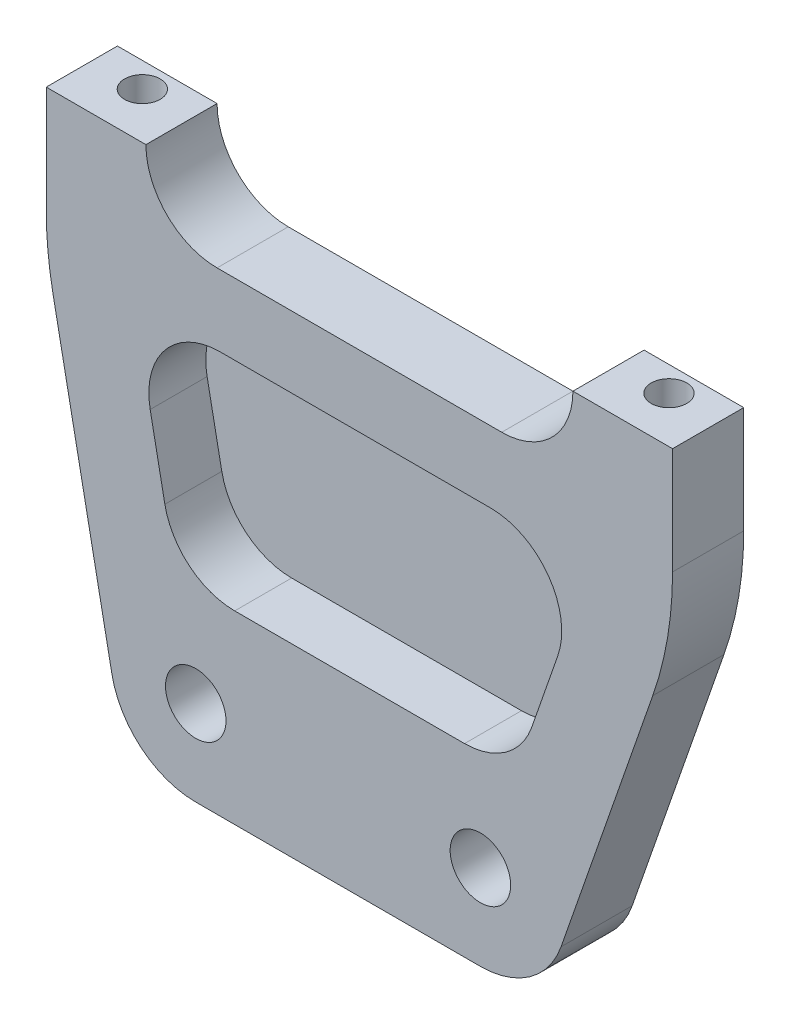
ISO-10303-21;
HEADER;
FILE_DESCRIPTION(('STEP AP214'),'2;1');
FILE_NAME('part.step','',(''),(''),'','','');
FILE_SCHEMA(('AUTOMOTIVE_DESIGN { 1 0 10303 214 1 1 1 1 }'));
ENDSEC;
DATA;
#1=APPLICATION_CONTEXT('core data for automotive mechanical design processes');
#2=APPLICATION_PROTOCOL_DEFINITION('international standard','automotive_design',2000,#1);
#3=PRODUCT_CONTEXT('',#1,'mechanical');
#4=PRODUCT('Part','Part','',(#3));
#5=PRODUCT_RELATED_PRODUCT_CATEGORY('part','',(#4));
#6=PRODUCT_DEFINITION_FORMATION('','',#4);
#7=PRODUCT_DEFINITION_CONTEXT('part definition',#1,'design');
#8=PRODUCT_DEFINITION('design','',#6,#7);
#9=PRODUCT_DEFINITION_SHAPE('','',#8);
#10=(LENGTH_UNIT() NAMED_UNIT(*) SI_UNIT(.MILLI.,.METRE.));
#11=(NAMED_UNIT(*) PLANE_ANGLE_UNIT() SI_UNIT($,.RADIAN.));
#12=(NAMED_UNIT(*) SI_UNIT($,.STERADIAN.) SOLID_ANGLE_UNIT());
#13=UNCERTAINTY_MEASURE_WITH_UNIT(LENGTH_MEASURE(1.E-05),#10,'distance_accuracy_value','');
#14=(GEOMETRIC_REPRESENTATION_CONTEXT(3) GLOBAL_UNCERTAINTY_ASSIGNED_CONTEXT((#13)) GLOBAL_UNIT_ASSIGNED_CONTEXT((#10,
#11,#12)) REPRESENTATION_CONTEXT('',''));
#15=CARTESIAN_POINT('',(0.,0.,0.));
#16=DIRECTION('',(0.,0.,1.));
#17=DIRECTION('',(1.,0.,0.));
#18=AXIS2_PLACEMENT_3D('',#15,#16,#17);
#19=CARTESIAN_POINT('',(-21.,49.5,12.7));
#20=DIRECTION('',(1.,0.,0.));
#21=DIRECTION('',(0.,0.,-1.));
#22=AXIS2_PLACEMENT_3D('',#19,#20,#21);
#23=PLANE('',#22);
#24=DIRECTION('',(0.,-1.,0.));
#25=VECTOR('',#24,1.);
#26=CARTESIAN_POINT('',(-21.,64.5,10.));
#27=LINE('',#26,#25);
#28=CARTESIAN_POINT('',(-21.,64.5,10.));
#29=VERTEX_POINT('',#28);
#30=CARTESIAN_POINT('',(-21.,49.5,10.));
#31=VERTEX_POINT('',#30);
#32=EDGE_CURVE('E212',#29,#31,#27,.T.);
#33=ORIENTED_EDGE('',*,*,#32,.F.);
#34=DIRECTION('',(0.,0.,-1.));
#35=VECTOR('',#34,1.);
#36=CARTESIAN_POINT('',(-21.,64.5,12.7));
#37=LINE('',#36,#35);
#38=CARTESIAN_POINT('',(-21.,64.5,0.));
#39=VERTEX_POINT('',#38);
#40=EDGE_CURVE('E289',#29,#39,#37,.T.);
#41=ORIENTED_EDGE('',*,*,#40,.T.);
#42=DIRECTION('',(0.,-1.,0.));
#43=VECTOR('',#42,1.);
#44=CARTESIAN_POINT('',(-21.,49.5,0.));
#45=LINE('',#44,#43);
#46=CARTESIAN_POINT('',(-21.,49.5,0.));
#47=VERTEX_POINT('',#46);
#48=EDGE_CURVE('E305',#39,#47,#45,.T.);
#49=ORIENTED_EDGE('',*,*,#48,.T.);
#50=DIRECTION('',(0.,0.,-1.));
#51=VECTOR('',#50,1.);
#52=CARTESIAN_POINT('',(-21.,49.5,12.7));
#53=LINE('',#52,#51);
#54=EDGE_CURVE('E54',#31,#47,#53,.T.);
#55=ORIENTED_EDGE('',*,*,#54,.F.);
#56=EDGE_LOOP('',(#33,#41,#49,#55));
#57=FACE_BOUND('',#56,.T.);
#58=ADVANCED_FACE('F46',(#57),#23,.F.);
#59=CARTESIAN_POINT('',(29.,49.5,12.7));
#60=DIRECTION('',(0.,0.,-1.));
#61=DIRECTION('',(-1.,0.,0.));
#62=AXIS2_PLACEMENT_3D('',#59,#60,#61);
#63=CYLINDRICAL_SURFACE('',#62,50.);
#64=CARTESIAN_POINT('',(29.,49.5,10.));
#65=DIRECTION('',(0.,0.,1.));
#66=DIRECTION('',(0.,-1.,0.));
#67=AXIS2_PLACEMENT_3D('',#64,#65,#66);
#68=CIRCLE('',#67,50.);
#69=CARTESIAN_POINT('',(-20.0617925425191,39.8594340148091,10.));
#70=VERTEX_POINT('',#69);
#71=EDGE_CURVE('E468',#31,#70,#68,.T.);
#72=ORIENTED_EDGE('',*,*,#71,.F.);
#73=ORIENTED_EDGE('',*,*,#54,.T.);
#74=CARTESIAN_POINT('',(29.,49.5,0.));
#75=DIRECTION('',(0.,0.,1.));
#76=DIRECTION('',(-1.,0.,0.));
#77=AXIS2_PLACEMENT_3D('',#74,#75,#76);
#78=CIRCLE('',#77,50.);
#79=CARTESIAN_POINT('',(-20.0617925425191,39.8594340148091,0.));
#80=VERTEX_POINT('',#79);
#81=EDGE_CURVE('E309',#47,#80,#78,.T.);
#82=ORIENTED_EDGE('',*,*,#81,.T.);
#83=DIRECTION('',(0.,0.,-1.));
#84=VECTOR('',#83,1.);
#85=CARTESIAN_POINT('',(-20.0617925425191,39.8594340148091,12.7));
#86=LINE('',#85,#84);
#87=EDGE_CURVE('E327',#70,#80,#86,.T.);
#88=ORIENTED_EDGE('',*,*,#87,.F.);
#89=EDGE_LOOP('',(#72,#73,#82,#88));
#90=FACE_BOUND('',#89,.T.);
#91=ADVANCED_FACE('F518',(#90),#63,.T.);
#92=CARTESIAN_POINT('',(-11.7748302102046,-2.3137358364458,12.7));
#93=DIRECTION('',(0.981235850850382,0.192811319703817,0.));
#94=DIRECTION('',(-0.192811319703817,0.981235850850382,0.));
#95=AXIS2_PLACEMENT_3D('',#92,#93,#94);
#96=PLANE('',#95);
#97=DIRECTION('',(-0.192811319703817,0.981235850850382,0.));
#98=VECTOR('',#97,1.);
#99=CARTESIAN_POINT('',(-11.7748302102046,-2.3137358364458,10.));
#100=LINE('',#99,#98);
#101=CARTESIAN_POINT('',(-11.7748302102046,-2.31373583644581,10.));
#102=VERTEX_POINT('',#101);
#103=EDGE_CURVE('E844',#102,#70,#100,.T.);
#104=ORIENTED_EDGE('',*,*,#103,.T.);
#105=ORIENTED_EDGE('',*,*,#87,.T.);
#106=DIRECTION('',(0.192811319703817,-0.981235850850382,0.));
#107=VECTOR('',#106,1.);
#108=CARTESIAN_POINT('',(-11.7748302102046,-2.3137358364458,0.));
#109=LINE('',#108,#107);
#110=CARTESIAN_POINT('',(-11.7748302102046,-2.31373583644581,0.));
#111=VERTEX_POINT('',#110);
#112=EDGE_CURVE('E313',#80,#111,#109,.T.);
#113=ORIENTED_EDGE('',*,*,#112,.T.);
#114=DIRECTION('',(0.,0.,-1.));
#115=VECTOR('',#114,1.);
#116=CARTESIAN_POINT('',(-11.7748302102046,-2.31373583644581,12.7));
#117=LINE('',#116,#115);
#118=EDGE_CURVE('E330',#102,#111,#117,.T.);
#119=ORIENTED_EDGE('',*,*,#118,.F.);
#120=EDGE_LOOP('',(#104,#105,#113,#119));
#121=FACE_BOUND('',#120,.T.);
#122=ADVANCED_FACE('F523',(#121),#96,.F.);
#123=CARTESIAN_POINT('',(64.2186319820096,33.0561320320449,12.7));
#124=DIRECTION('',(-0.944372639640192,0.328877359359102,0.));
#125=DIRECTION('',(-0.328877359359102,-0.944372639640192,0.));
#126=AXIS2_PLACEMENT_3D('',#123,#124,#125);
#127=PLANE('',#126);
#128=DIRECTION('',(0.,0.,-1.));
#129=VECTOR('',#128,1.);
#130=CARTESIAN_POINT('',(64.2186319820096,33.0561320320449,12.7));
#131=LINE('',#130,#129);
#132=CARTESIAN_POINT('',(64.2186319820096,33.0561320320449,10.));
#133=VERTEX_POINT('',#132);
#134=CARTESIAN_POINT('',(64.2186319820096,33.0561320320449,0.));
#135=VERTEX_POINT('',#134);
#136=EDGE_CURVE('E229',#133,#135,#131,.T.);
#137=ORIENTED_EDGE('',*,*,#136,.F.);
#138=DIRECTION('',(-0.328877359359102,-0.944372639640192,0.));
#139=VECTOR('',#138,1.);
#140=CARTESIAN_POINT('',(64.2186319820096,33.0561320320449,10.));
#141=LINE('',#140,#139);
#142=CARTESIAN_POINT('',(51.3324716756823,-3.94652831230924,9.99999999999999));
#143=VERTEX_POINT('',#142);
#144=EDGE_CURVE('E504',#133,#143,#141,.T.);
#145=ORIENTED_EDGE('',*,*,#144,.T.);
#146=DIRECTION('',(0.,0.,-1.));
#147=VECTOR('',#146,1.);
#148=CARTESIAN_POINT('',(51.3324716756823,-3.94652831230923,12.7));
#149=LINE('',#148,#147);
#150=CARTESIAN_POINT('',(51.3324716756823,-3.94652831230923,0.));
#151=VERTEX_POINT('',#150);
#152=EDGE_CURVE('E856',#143,#151,#149,.T.);
#153=ORIENTED_EDGE('',*,*,#152,.T.);
#154=DIRECTION('',(0.328877359359102,0.944372639640192,0.));
#155=VECTOR('',#154,1.);
#156=CARTESIAN_POINT('',(64.2186319820096,33.0561320320449,0.));
#157=LINE('',#156,#155);
#158=EDGE_CURVE('E250',#151,#135,#157,.T.);
#159=ORIENTED_EDGE('',*,*,#158,.T.);
#160=EDGE_LOOP('',(#137,#145,#153,#159));
#161=FACE_BOUND('',#160,.T.);
#162=ADVANCED_FACE('F527',(#161),#127,.F.);
#163=CARTESIAN_POINT('',(17.,49.5,12.7));
#164=DIRECTION('',(0.,0.,-1.));
#165=DIRECTION('',(-1.,0.,0.));
#166=AXIS2_PLACEMENT_3D('',#163,#164,#165);
#167=CYLINDRICAL_SURFACE('',#166,50.);
#168=CARTESIAN_POINT('',(17.,49.5,10.));
#169=DIRECTION('',(0.,0.,1.));
#170=DIRECTION('',(0.,-1.,0.));
#171=AXIS2_PLACEMENT_3D('',#168,#169,#170);
#172=CIRCLE('',#171,50.);
#173=CARTESIAN_POINT('',(67.,49.5,10.));
#174=VERTEX_POINT('',#173);
#175=EDGE_CURVE('E208',#133,#174,#172,.T.);
#176=ORIENTED_EDGE('',*,*,#175,.F.);
#177=ORIENTED_EDGE('',*,*,#136,.T.);
#178=CARTESIAN_POINT('',(17.,49.5,0.));
#179=DIRECTION('',(0.,0.,1.));
#180=DIRECTION('',(-1.,0.,0.));
#181=AXIS2_PLACEMENT_3D('',#178,#179,#180);
#182=CIRCLE('',#181,50.);
#183=CARTESIAN_POINT('',(67.,49.5,0.));
#184=VERTEX_POINT('',#183);
#185=EDGE_CURVE('E246',#135,#184,#182,.T.);
#186=ORIENTED_EDGE('',*,*,#185,.T.);
#187=DIRECTION('',(0.,0.,-1.));
#188=VECTOR('',#187,1.);
#189=CARTESIAN_POINT('',(67.,49.5,12.7));
#190=LINE('',#189,#188);
#191=EDGE_CURVE('E227',#174,#184,#190,.T.);
#192=ORIENTED_EDGE('',*,*,#191,.F.);
#193=EDGE_LOOP('',(#176,#177,#186,#192));
#194=FACE_BOUND('',#193,.T.);
#195=ADVANCED_FACE('F546',(#194),#167,.T.);
#196=CARTESIAN_POINT('',(67.,64.5,12.7));
#197=DIRECTION('',(-1.,0.,0.));
#198=DIRECTION('',(0.,0.,1.));
#199=AXIS2_PLACEMENT_3D('',#196,#197,#198);
#200=PLANE('',#199);
#201=DIRECTION('',(0.,-1.,0.));
#202=VECTOR('',#201,1.);
#203=CARTESIAN_POINT('',(67.,64.5,10.));
#204=LINE('',#203,#202);
#205=CARTESIAN_POINT('',(67.,64.5,10.));
#206=VERTEX_POINT('',#205);
#207=EDGE_CURVE('E201',#206,#174,#204,.T.);
#208=ORIENTED_EDGE('',*,*,#207,.T.);
#209=ORIENTED_EDGE('',*,*,#191,.T.);
#210=DIRECTION('',(0.,1.,0.));
#211=VECTOR('',#210,1.);
#212=CARTESIAN_POINT('',(67.,64.5,0.));
#213=LINE('',#212,#211);
#214=CARTESIAN_POINT('',(67.,64.5,0.));
#215=VERTEX_POINT('',#214);
#216=EDGE_CURVE('E225',#184,#215,#213,.T.);
#217=ORIENTED_EDGE('',*,*,#216,.T.);
#218=DIRECTION('',(0.,0.,-1.));
#219=VECTOR('',#218,1.);
#220=CARTESIAN_POINT('',(67.,64.5,12.7));
#221=LINE('',#220,#219);
#222=EDGE_CURVE('E218',#206,#215,#221,.T.);
#223=ORIENTED_EDGE('',*,*,#222,.F.);
#224=EDGE_LOOP('',(#208,#209,#217,#223));
#225=FACE_BOUND('',#224,.T.);
#226=ADVANCED_FACE('F223',(#225),#200,.F.);
#227=CARTESIAN_POINT('',(53.,64.5,12.7));
#228=DIRECTION('',(0.,-1.,0.));
#229=DIRECTION('',(0.,0.,-1.));
#230=AXIS2_PLACEMENT_3D('',#227,#228,#229);
#231=PLANE('',#230);
#232=CARTESIAN_POINT('',(60.,64.5,3.5));
#233=DIRECTION('',(0.,1.,0.));
#234=DIRECTION('',(0.,0.,1.));
#235=AXIS2_PLACEMENT_3D('',#232,#233,#234);
#236=CIRCLE('',#235,2.49999999999999);
#237=CARTESIAN_POINT('',(60.,64.5,5.99999999999999));
#238=VERTEX_POINT('',#237);
#239=EDGE_CURVE('E496',#238,#238,#236,.T.);
#240=ORIENTED_EDGE('',*,*,#239,.F.);
#241=EDGE_LOOP('',(#240));
#242=FACE_BOUND('',#241,.T.);
#243=DIRECTION('',(1.,0.,0.));
#244=VECTOR('',#243,1.);
#245=CARTESIAN_POINT('',(-21.,64.5,10.));
#246=LINE('',#245,#244);
#247=CARTESIAN_POINT('',(53.,64.5,10.));
#248=VERTEX_POINT('',#247);
#249=EDGE_CURVE('E205',#248,#206,#246,.T.);
#250=ORIENTED_EDGE('',*,*,#249,.T.);
#251=ORIENTED_EDGE('',*,*,#222,.T.);
#252=DIRECTION('',(-1.,0.,0.));
#253=VECTOR('',#252,1.);
#254=CARTESIAN_POINT('',(53.,64.5,0.));
#255=LINE('',#254,#253);
#256=CARTESIAN_POINT('',(53.,64.5,0.));
#257=VERTEX_POINT('',#256);
#258=EDGE_CURVE('E255',#215,#257,#255,.T.);
#259=ORIENTED_EDGE('',*,*,#258,.T.);
#260=DIRECTION('',(0.,0.,-1.));
#261=VECTOR('',#260,1.);
#262=CARTESIAN_POINT('',(53.,64.5,12.7));
#263=LINE('',#262,#261);
#264=EDGE_CURVE('E220',#248,#257,#263,.T.);
#265=ORIENTED_EDGE('',*,*,#264,.F.);
#266=EDGE_LOOP('',(#250,#251,#259,#265));
#267=FACE_BOUND('',#266,.T.);
#268=ADVANCED_FACE('F216',(#242,#267),#231,.F.);
#269=CARTESIAN_POINT('',(43.,64.5,12.7));
#270=DIRECTION('',(0.,0.,-1.));
#271=DIRECTION('',(-1.,0.,0.));
#272=AXIS2_PLACEMENT_3D('',#269,#270,#271);
#273=CYLINDRICAL_SURFACE('',#272,10.);
#274=CARTESIAN_POINT('',(43.,64.5,10.));
#275=DIRECTION('',(0.,0.,1.));
#276=DIRECTION('',(0.,-1.,0.));
#277=AXIS2_PLACEMENT_3D('',#274,#275,#276);
#278=CIRCLE('',#277,10.);
#279=CARTESIAN_POINT('',(43.,54.5,10.));
#280=VERTEX_POINT('',#279);
#281=EDGE_CURVE('E471',#248,#280,#278,.F.);
#282=ORIENTED_EDGE('',*,*,#281,.F.);
#283=ORIENTED_EDGE('',*,*,#264,.T.);
#284=CARTESIAN_POINT('',(43.,64.5,0.));
#285=DIRECTION('',(0.,0.,-1.));
#286=DIRECTION('',(1.,0.,0.));
#287=AXIS2_PLACEMENT_3D('',#284,#285,#286);
#288=CIRCLE('',#287,10.);
#289=CARTESIAN_POINT('',(43.,54.5,0.));
#290=VERTEX_POINT('',#289);
#291=EDGE_CURVE('E258',#257,#290,#288,.T.);
#292=ORIENTED_EDGE('',*,*,#291,.T.);
#293=DIRECTION('',(0.,0.,-1.));
#294=VECTOR('',#293,1.);
#295=CARTESIAN_POINT('',(43.,54.5,12.7));
#296=LINE('',#295,#294);
#297=EDGE_CURVE('E231',#280,#290,#296,.T.);
#298=ORIENTED_EDGE('',*,*,#297,.F.);
#299=EDGE_LOOP('',(#282,#283,#292,#298));
#300=FACE_BOUND('',#299,.T.);
#301=ADVANCED_FACE('F555',(#300),#273,.F.);
#302=CARTESIAN_POINT('',(3.,54.5,12.7));
#303=DIRECTION('',(0.,-1.,0.));
#304=DIRECTION('',(0.,0.,-1.));
#305=AXIS2_PLACEMENT_3D('',#302,#303,#304);
#306=PLANE('',#305);
#307=DIRECTION('',(-1.,0.,0.));
#308=VECTOR('',#307,1.);
#309=CARTESIAN_POINT('',(3.,54.5,10.));
#310=LINE('',#309,#308);
#311=CARTESIAN_POINT('',(3.,54.5,10.));
#312=VERTEX_POINT('',#311);
#313=EDGE_CURVE('E473',#280,#312,#310,.T.);
#314=ORIENTED_EDGE('',*,*,#313,.F.);
#315=ORIENTED_EDGE('',*,*,#297,.T.);
#316=DIRECTION('',(-1.,0.,0.));
#317=VECTOR('',#316,1.);
#318=CARTESIAN_POINT('',(3.,54.5,0.));
#319=LINE('',#318,#317);
#320=CARTESIAN_POINT('',(2.99999999999999,54.5,0.));
#321=VERTEX_POINT('',#320);
#322=EDGE_CURVE('E276',#290,#321,#319,.T.);
#323=ORIENTED_EDGE('',*,*,#322,.T.);
#324=DIRECTION('',(0.,0.,-1.));
#325=VECTOR('',#324,1.);
#326=CARTESIAN_POINT('',(2.99999999999999,54.5,12.7));
#327=LINE('',#326,#325);
#328=EDGE_CURVE('E267',#312,#321,#327,.T.);
#329=ORIENTED_EDGE('',*,*,#328,.F.);
#330=EDGE_LOOP('',(#314,#315,#323,#329));
#331=FACE_BOUND('',#330,.T.);
#332=ADVANCED_FACE('F559',(#331),#306,.F.);
#333=CARTESIAN_POINT('',(3.,64.5,12.7));
#334=DIRECTION('',(0.,0.,-1.));
#335=DIRECTION('',(-1.,0.,0.));
#336=AXIS2_PLACEMENT_3D('',#333,#334,#335);
#337=CYLINDRICAL_SURFACE('',#336,10.);
#338=CARTESIAN_POINT('',(3.,64.5,10.));
#339=DIRECTION('',(0.,0.,1.));
#340=DIRECTION('',(0.,-1.,0.));
#341=AXIS2_PLACEMENT_3D('',#338,#339,#340);
#342=CIRCLE('',#341,10.);
#343=CARTESIAN_POINT('',(-7.00000000000001,64.5,10.));
#344=VERTEX_POINT('',#343);
#345=EDGE_CURVE('E475',#312,#344,#342,.F.);
#346=ORIENTED_EDGE('',*,*,#345,.F.);
#347=ORIENTED_EDGE('',*,*,#328,.T.);
#348=CARTESIAN_POINT('',(3.,64.5,0.));
#349=DIRECTION('',(0.,0.,-1.));
#350=DIRECTION('',(1.,0.,0.));
#351=AXIS2_PLACEMENT_3D('',#348,#349,#350);
#352=CIRCLE('',#351,10.);
#353=CARTESIAN_POINT('',(-7.00000000000001,64.5,0.));
#354=VERTEX_POINT('',#353);
#355=EDGE_CURVE('E280',#321,#354,#352,.T.);
#356=ORIENTED_EDGE('',*,*,#355,.T.);
#357=DIRECTION('',(0.,0.,-1.));
#358=VECTOR('',#357,1.);
#359=CARTESIAN_POINT('',(-7.00000000000001,64.5,12.7));
#360=LINE('',#359,#358);
#361=EDGE_CURVE('E270',#344,#354,#360,.T.);
#362=ORIENTED_EDGE('',*,*,#361,.F.);
#363=EDGE_LOOP('',(#346,#347,#356,#362));
#364=FACE_BOUND('',#363,.T.);
#365=ADVANCED_FACE('F563',(#364),#337,.F.);
#366=CARTESIAN_POINT('',(-21.,64.5,12.7));
#367=DIRECTION('',(0.,-1.,0.));
#368=DIRECTION('',(0.,0.,-1.));
#369=AXIS2_PLACEMENT_3D('',#366,#367,#368);
#370=PLANE('',#369);
#371=CARTESIAN_POINT('',(-14.,64.5,3.5));
#372=DIRECTION('',(0.,1.,0.));
#373=DIRECTION('',(0.,0.,1.));
#374=AXIS2_PLACEMENT_3D('',#371,#372,#373);
#375=CIRCLE('',#374,2.49999999999999);
#376=CARTESIAN_POINT('',(-14.,64.5,5.99999999999999));
#377=VERTEX_POINT('',#376);
#378=EDGE_CURVE('E441',#377,#377,#375,.T.);
#379=ORIENTED_EDGE('',*,*,#378,.F.);
#380=EDGE_LOOP('',(#379));
#381=FACE_BOUND('',#380,.T.);
#382=EDGE_CURVE('E221',#29,#344,#246,.T.);
#383=ORIENTED_EDGE('',*,*,#382,.T.);
#384=ORIENTED_EDGE('',*,*,#361,.T.);
#385=DIRECTION('',(-1.,0.,0.));
#386=VECTOR('',#385,1.);
#387=CARTESIAN_POINT('',(-21.,64.5,0.));
#388=LINE('',#387,#386);
#389=EDGE_CURVE('E284',#354,#39,#388,.T.);
#390=ORIENTED_EDGE('',*,*,#389,.T.);
#391=ORIENTED_EDGE('',*,*,#40,.F.);
#392=EDGE_LOOP('',(#383,#384,#390,#391));
#393=FACE_BOUND('',#392,.T.);
#394=ADVANCED_FACE('F300',(#381,#393),#370,.F.);
#395=CARTESIAN_POINT('',(5.47526705475786,24.,12.7));
#396=DIRECTION('',(0.,0.,-1.));
#397=DIRECTION('',(-1.,0.,0.));
#398=AXIS2_PLACEMENT_3D('',#395,#396,#397);
#399=CYLINDRICAL_SURFACE('',#398,10.);
#400=DIRECTION('',(0.,0.,-1.));
#401=VECTOR('',#400,1.);
#402=CARTESIAN_POINT('',(-4.33709145374596,22.0718868029618,12.7));
#403=LINE('',#402,#401);
#404=CARTESIAN_POINT('',(-4.33709145374596,22.0718868029618,10.));
#405=VERTEX_POINT('',#404);
#406=CARTESIAN_POINT('',(-4.33709145374596,22.0718868029618,2.));
#407=VERTEX_POINT('',#406);
#408=EDGE_CURVE('E398',#405,#407,#403,.T.);
#409=ORIENTED_EDGE('',*,*,#408,.F.);
#410=CARTESIAN_POINT('',(5.47526705475786,24.,10.));
#411=DIRECTION('',(0.,0.,-1.));
#412=DIRECTION('',(0.,1.,0.));
#413=AXIS2_PLACEMENT_3D('',#410,#411,#412);
#414=CIRCLE('',#413,10.);
#415=CARTESIAN_POINT('',(5.47526705475786,14.,10.));
#416=VERTEX_POINT('',#415);
#417=EDGE_CURVE('E501',#416,#405,#414,.T.);
#418=ORIENTED_EDGE('',*,*,#417,.F.);
#419=DIRECTION('',(0.,0.,-1.));
#420=VECTOR('',#419,1.);
#421=CARTESIAN_POINT('',(5.47526705475786,14.,12.7));
#422=LINE('',#421,#420);
#423=CARTESIAN_POINT('',(5.47526705475786,14.,2.));
#424=VERTEX_POINT('',#423);
#425=EDGE_CURVE('E311',#416,#424,#422,.T.);
#426=ORIENTED_EDGE('',*,*,#425,.T.);
#427=CARTESIAN_POINT('',(5.47526705475786,24.,2.));
#428=DIRECTION('',(0.,0.,1.));
#429=DIRECTION('',(1.,0.,0.));
#430=AXIS2_PLACEMENT_3D('',#427,#428,#429);
#431=CIRCLE('',#430,10.);
#432=EDGE_CURVE('E405',#407,#424,#431,.T.);
#433=ORIENTED_EDGE('',*,*,#432,.F.);
#434=EDGE_LOOP('',(#409,#418,#426,#433));
#435=FACE_BOUND('',#434,.T.);
#436=ADVANCED_FACE('F570',(#435),#399,.F.);
#437=CARTESIAN_POINT('',(37.7689491552992,24.,12.7));
#438=DIRECTION('',(0.,0.,-1.));
#439=DIRECTION('',(-1.,0.,0.));
#440=AXIS2_PLACEMENT_3D('',#437,#438,#439);
#441=CYLINDRICAL_SURFACE('',#440,10.);
#442=CARTESIAN_POINT('',(37.7689491552992,24.,10.));
#443=DIRECTION('',(0.,0.,-1.));
#444=DIRECTION('',(0.,1.,0.));
#445=AXIS2_PLACEMENT_3D('',#442,#443,#444);
#446=CIRCLE('',#445,10.);
#447=CARTESIAN_POINT('',(47.2126755517012,20.711226406409,10.));
#448=VERTEX_POINT('',#447);
#449=CARTESIAN_POINT('',(37.7689491552992,14.,10.));
#450=VERTEX_POINT('',#449);
#451=EDGE_CURVE('E13',#448,#450,#446,.T.);
#452=ORIENTED_EDGE('',*,*,#451,.F.);
#453=DIRECTION('',(0.,0.,-1.));
#454=VECTOR('',#453,1.);
#455=CARTESIAN_POINT('',(47.2126755517012,20.711226406409,12.7));
#456=LINE('',#455,#454);
#457=CARTESIAN_POINT('',(47.2126755517012,20.711226406409,2.));
#458=VERTEX_POINT('',#457);
#459=EDGE_CURVE('E359',#448,#458,#456,.T.);
#460=ORIENTED_EDGE('',*,*,#459,.T.);
#461=CARTESIAN_POINT('',(37.7689491552992,24.,2.));
#462=DIRECTION('',(0.,0.,1.));
#463=DIRECTION('',(1.,0.,0.));
#464=AXIS2_PLACEMENT_3D('',#461,#462,#463);
#465=CIRCLE('',#464,10.);
#466=CARTESIAN_POINT('',(37.7689491552992,14.,2.));
#467=VERTEX_POINT('',#466);
#468=EDGE_CURVE('E69',#467,#458,#465,.T.);
#469=ORIENTED_EDGE('',*,*,#468,.F.);
#470=DIRECTION('',(0.,0.,-1.));
#471=VECTOR('',#470,1.);
#472=CARTESIAN_POINT('',(37.7689491552992,14.,12.7));
#473=LINE('',#472,#471);
#474=EDGE_CURVE('E315',#450,#467,#473,.T.);
#475=ORIENTED_EDGE('',*,*,#474,.F.);
#476=EDGE_LOOP('',(#452,#460,#469,#475));
#477=FACE_BOUND('',#476,.T.);
#478=ADVANCED_FACE('F577',(#477),#441,.F.);
#479=CARTESIAN_POINT('',(47.2126755517012,20.711226406409,12.7));
#480=DIRECTION('',(-0.944372639640192,0.328877359359102,0.));
#481=DIRECTION('',(-0.328877359359102,-0.944372639640192,0.));
#482=AXIS2_PLACEMENT_3D('',#479,#480,#481);
#483=PLANE('',#482);
#484=ORIENTED_EDGE('',*,*,#459,.F.);
#485=DIRECTION('',(0.328877359359102,0.944372639640192,0.));
#486=VECTOR('',#485,1.);
#487=CARTESIAN_POINT('',(47.2126755517012,20.711226406409,10.));
#488=LINE('',#487,#486);
#489=CARTESIAN_POINT('',(50.8692959664838,31.2112264064089,10.));
#490=VERTEX_POINT('',#489);
#491=EDGE_CURVE('E424',#448,#490,#488,.T.);
#492=ORIENTED_EDGE('',*,*,#491,.T.);
#493=DIRECTION('',(0.,0.,-1.));
#494=VECTOR('',#493,1.);
#495=CARTESIAN_POINT('',(50.8692959664838,31.2112264064089,12.7));
#496=LINE('',#495,#494);
#497=CARTESIAN_POINT('',(50.8692959664838,31.2112264064089,2.));
#498=VERTEX_POINT('',#497);
#499=EDGE_CURVE('E355',#490,#498,#496,.T.);
#500=ORIENTED_EDGE('',*,*,#499,.T.);
#501=DIRECTION('',(0.328877359359102,0.944372639640192,0.));
#502=VECTOR('',#501,1.);
#503=CARTESIAN_POINT('',(47.2126755517012,20.711226406409,2.));
#504=LINE('',#503,#502);
#505=EDGE_CURVE('E369',#458,#498,#504,.T.);
#506=ORIENTED_EDGE('',*,*,#505,.F.);
#507=EDGE_LOOP('',(#484,#492,#500,#506));
#508=FACE_BOUND('',#507,.T.);
#509=ADVANCED_FACE('F420',(#508),#483,.T.);
#510=CARTESIAN_POINT('',(41.425569570082,34.5,12.7));
#511=DIRECTION('',(0.,0.,-1.));
#512=DIRECTION('',(-1.,0.,0.));
#513=AXIS2_PLACEMENT_3D('',#510,#511,#512);
#514=CYLINDRICAL_SURFACE('',#513,10.);
#515=ORIENTED_EDGE('',*,*,#499,.F.);
#516=CARTESIAN_POINT('',(41.425569570082,34.5,10.));
#517=DIRECTION('',(0.,0.,1.));
#518=DIRECTION('',(0.,-1.,0.));
#519=AXIS2_PLACEMENT_3D('',#516,#517,#518);
#520=CIRCLE('',#519,10.);
#521=CARTESIAN_POINT('',(41.4255695700819,44.5,10.));
#522=VERTEX_POINT('',#521);
#523=EDGE_CURVE('E430',#490,#522,#520,.T.);
#524=ORIENTED_EDGE('',*,*,#523,.T.);
#525=DIRECTION('',(0.,0.,-1.));
#526=VECTOR('',#525,1.);
#527=CARTESIAN_POINT('',(41.4255695700819,44.5,12.7));
#528=LINE('',#527,#526);
#529=CARTESIAN_POINT('',(41.4255695700819,44.5,2.));
#530=VERTEX_POINT('',#529);
#531=EDGE_CURVE('E360',#522,#530,#528,.T.);
#532=ORIENTED_EDGE('',*,*,#531,.T.);
#533=CARTESIAN_POINT('',(41.425569570082,34.5,2.));
#534=DIRECTION('',(0.,0.,1.));
#535=DIRECTION('',(1.,0.,0.));
#536=AXIS2_PLACEMENT_3D('',#533,#534,#535);
#537=CIRCLE('',#536,10.);
#538=EDGE_CURVE('E373',#498,#530,#537,.T.);
#539=ORIENTED_EDGE('',*,*,#538,.F.);
#540=EDGE_LOOP('',(#515,#524,#532,#539));
#541=FACE_BOUND('',#540,.T.);
#542=ADVANCED_FACE('F427',(#541),#514,.F.);
#543=CARTESIAN_POINT('',(41.4255695700819,44.5,12.7));
#544=DIRECTION('',(0.,-1.,0.));
#545=DIRECTION('',(1.,0.,0.));
#546=AXIS2_PLACEMENT_3D('',#543,#544,#545);
#547=PLANE('',#546);
#548=ORIENTED_EDGE('',*,*,#531,.F.);
#549=DIRECTION('',(-1.,0.,0.));
#550=VECTOR('',#549,1.);
#551=CARTESIAN_POINT('',(41.4255695700819,44.5,10.));
#552=LINE('',#551,#550);
#553=CARTESIAN_POINT('',(3.41203337333919,44.5,10.));
#554=VERTEX_POINT('',#553);
#555=EDGE_CURVE('E484',#522,#554,#552,.T.);
#556=ORIENTED_EDGE('',*,*,#555,.T.);
#557=DIRECTION('',(0.,0.,-1.));
#558=VECTOR('',#557,1.);
#559=CARTESIAN_POINT('',(3.41203337333919,44.5,12.7));
#560=LINE('',#559,#558);
#561=CARTESIAN_POINT('',(3.41203337333919,44.5,2.));
#562=VERTEX_POINT('',#561);
#563=EDGE_CURVE('E392',#554,#562,#560,.T.);
#564=ORIENTED_EDGE('',*,*,#563,.T.);
#565=DIRECTION('',(-1.,0.,0.));
#566=VECTOR('',#565,1.);
#567=CARTESIAN_POINT('',(41.4255695700819,44.5,2.));
#568=LINE('',#567,#566);
#569=EDGE_CURVE('E379',#530,#562,#568,.T.);
#570=ORIENTED_EDGE('',*,*,#569,.F.);
#571=EDGE_LOOP('',(#548,#556,#564,#570));
#572=FACE_BOUND('',#571,.T.);
#573=ADVANCED_FACE('F433',(#572),#547,.T.);
#574=CARTESIAN_POINT('',(3.41203337333911,34.5,12.7));
#575=DIRECTION('',(0.,0.,-1.));
#576=DIRECTION('',(-1.,0.,0.));
#577=AXIS2_PLACEMENT_3D('',#574,#575,#576);
#578=CYLINDRICAL_SURFACE('',#577,10.);
#579=ORIENTED_EDGE('',*,*,#563,.F.);
#580=CARTESIAN_POINT('',(3.41203337333911,34.5,10.));
#581=DIRECTION('',(0.,0.,1.));
#582=DIRECTION('',(0.,-1.,0.));
#583=AXIS2_PLACEMENT_3D('',#580,#581,#582);
#584=CIRCLE('',#583,10.);
#585=CARTESIAN_POINT('',(-6.4003251351647,32.5718868029617,10.));
#586=VERTEX_POINT('',#585);
#587=EDGE_CURVE('E480',#554,#586,#584,.T.);
#588=ORIENTED_EDGE('',*,*,#587,.T.);
#589=DIRECTION('',(0.,0.,-1.));
#590=VECTOR('',#589,1.);
#591=CARTESIAN_POINT('',(-6.40032513516469,32.5718868029617,12.7));
#592=LINE('',#591,#590);
#593=CARTESIAN_POINT('',(-6.40032513516469,32.5718868029617,2.));
#594=VERTEX_POINT('',#593);
#595=EDGE_CURVE('E395',#586,#594,#592,.T.);
#596=ORIENTED_EDGE('',*,*,#595,.T.);
#597=CARTESIAN_POINT('',(3.41203337333911,34.5,2.));
#598=DIRECTION('',(0.,0.,1.));
#599=DIRECTION('',(1.,0.,0.));
#600=AXIS2_PLACEMENT_3D('',#597,#598,#599);
#601=CIRCLE('',#600,10.);
#602=EDGE_CURVE('E384',#562,#594,#601,.T.);
#603=ORIENTED_EDGE('',*,*,#602,.F.);
#604=EDGE_LOOP('',(#579,#588,#596,#603));
#605=FACE_BOUND('',#604,.T.);
#606=ADVANCED_FACE('F590',(#605),#578,.F.);
#607=CARTESIAN_POINT('',(-6.40032513516469,32.5718868029617,12.7));
#608=DIRECTION('',(0.981235850850381,0.192811319703818,0.));
#609=DIRECTION('',(-0.192811319703818,0.981235850850381,0.));
#610=AXIS2_PLACEMENT_3D('',#607,#608,#609);
#611=PLANE('',#610);
#612=ORIENTED_EDGE('',*,*,#595,.F.);
#613=DIRECTION('',(0.192811319703818,-0.981235850850381,0.));
#614=VECTOR('',#613,1.);
#615=CARTESIAN_POINT('',(-6.40032513516469,32.5718868029617,10.));
#616=LINE('',#615,#614);
#617=EDGE_CURVE('E477',#586,#405,#616,.T.);
#618=ORIENTED_EDGE('',*,*,#617,.T.);
#619=ORIENTED_EDGE('',*,*,#408,.T.);
#620=DIRECTION('',(0.192811319703818,-0.981235850850381,0.));
#621=VECTOR('',#620,1.);
#622=CARTESIAN_POINT('',(-6.40032513516469,32.5718868029617,2.));
#623=LINE('',#622,#621);
#624=EDGE_CURVE('E439',#594,#407,#623,.T.);
#625=ORIENTED_EDGE('',*,*,#624,.F.);
#626=EDGE_LOOP('',(#612,#618,#619,#625));
#627=FACE_BOUND('',#626,.T.);
#628=ADVANCED_FACE('F593',(#627),#611,.T.);
#629=CARTESIAN_POINT('',(-21.,17.5,10.));
#630=DIRECTION('',(0.,0.,-1.));
#631=DIRECTION('',(0.,1.,0.));
#632=AXIS2_PLACEMENT_3D('',#629,#630,#631);
#633=PLANE('',#632);
#634=ORIENTED_EDGE('',*,*,#417,.T.);
#635=ORIENTED_EDGE('',*,*,#617,.F.);
#636=ORIENTED_EDGE('',*,*,#587,.F.);
#637=ORIENTED_EDGE('',*,*,#555,.F.);
#638=ORIENTED_EDGE('',*,*,#523,.F.);
#639=ORIENTED_EDGE('',*,*,#491,.F.);
#640=ORIENTED_EDGE('',*,*,#451,.T.);
#641=DIRECTION('',(-1.,0.,0.));
#642=VECTOR('',#641,1.);
#643=CARTESIAN_POINT('',(5.47526705475786,14.,10.));
#644=LINE('',#643,#642);
#645=EDGE_CURVE('E499',#450,#416,#644,.T.);
#646=ORIENTED_EDGE('',*,*,#645,.T.);
#647=EDGE_LOOP('',(#634,#635,#636,#637,#638,#639,#640,#646));
#648=FACE_BOUND('',#647,.T.);
#649=CARTESIAN_POINT('',(40.,0.,10.));
#650=DIRECTION('',(0.,0.,1.));
#651=DIRECTION('',(1.,0.,0.));
#652=AXIS2_PLACEMENT_3D('',#649,#650,#651);
#653=CIRCLE('',#652,4.25);
#654=CARTESIAN_POINT('',(44.25,0.,10.));
#655=VERTEX_POINT('',#654);
#656=EDGE_CURVE('E456',#655,#655,#653,.T.);
#657=ORIENTED_EDGE('',*,*,#656,.F.);
#658=EDGE_LOOP('',(#657));
#659=FACE_BOUND('',#658,.T.);
#660=CARTESIAN_POINT('',(0.,0.,10.));
#661=DIRECTION('',(0.,0.,-1.));
#662=DIRECTION('',(0.,1.,0.));
#663=AXIS2_PLACEMENT_3D('',#660,#661,#662);
#664=CIRCLE('',#663,12.);
#665=CARTESIAN_POINT('',(0.,-12.,9.99999999999999));
#666=VERTEX_POINT('',#665);
#667=EDGE_CURVE('E845',#666,#102,#664,.T.);
#668=ORIENTED_EDGE('',*,*,#667,.F.);
#669=DIRECTION('',(1.,0.,0.));
#670=VECTOR('',#669,1.);
#671=CARTESIAN_POINT('',(-21.,-12.,9.99999999999999));
#672=LINE('',#671,#670);
#673=CARTESIAN_POINT('',(40.,-12.,9.99999999999999));
#674=VERTEX_POINT('',#673);
#675=EDGE_CURVE('E495',#666,#674,#672,.T.);
#676=ORIENTED_EDGE('',*,*,#675,.T.);
#677=CARTESIAN_POINT('',(40.,0.,10.));
#678=DIRECTION('',(0.,0.,-1.));
#679=DIRECTION('',(0.,1.,0.));
#680=AXIS2_PLACEMENT_3D('',#677,#678,#679);
#681=CIRCLE('',#680,12.);
#682=EDGE_CURVE('E848',#143,#674,#681,.T.);
#683=ORIENTED_EDGE('',*,*,#682,.F.);
#684=ORIENTED_EDGE('',*,*,#144,.F.);
#685=ORIENTED_EDGE('',*,*,#175,.T.);
#686=ORIENTED_EDGE('',*,*,#207,.F.);
#687=ORIENTED_EDGE('',*,*,#249,.F.);
#688=ORIENTED_EDGE('',*,*,#281,.T.);
#689=ORIENTED_EDGE('',*,*,#313,.T.);
#690=ORIENTED_EDGE('',*,*,#345,.T.);
#691=ORIENTED_EDGE('',*,*,#382,.F.);
#692=ORIENTED_EDGE('',*,*,#32,.T.);
#693=ORIENTED_EDGE('',*,*,#71,.T.);
#694=ORIENTED_EDGE('',*,*,#103,.F.);
#695=EDGE_LOOP('',(#668,#676,#683,#684,#685,#686,#687,#688,#689,#690,#691,#692,#693,#694));
#696=FACE_BOUND('',#695,.T.);
#697=CARTESIAN_POINT('',(0.,0.,10.));
#698=DIRECTION('',(0.,0.,1.));
#699=DIRECTION('',(1.,0.,0.));
#700=AXIS2_PLACEMENT_3D('',#697,#698,#699);
#701=CIRCLE('',#700,4.25);
#702=CARTESIAN_POINT('',(4.25,0.,10.));
#703=VERTEX_POINT('',#702);
#704=EDGE_CURVE('E463',#703,#703,#701,.T.);
#705=ORIENTED_EDGE('',*,*,#704,.F.);
#706=EDGE_LOOP('',(#705));
#707=FACE_BOUND('',#706,.T.);
#708=ADVANCED_FACE('F203',(#648,#659,#696,#707),#633,.F.);
#709=CARTESIAN_POINT('',(3.,64.5,0.));
#710=DIRECTION('',(0.,0.,1.));
#711=DIRECTION('',(1.,0.,0.));
#712=AXIS2_PLACEMENT_3D('',#709,#710,#711);
#713=PLANE('',#712);
#714=CARTESIAN_POINT('',(0.,0.,0.));
#715=DIRECTION('',(0.,0.,1.));
#716=DIRECTION('',(1.,0.,0.));
#717=AXIS2_PLACEMENT_3D('',#714,#715,#716);
#718=CIRCLE('',#717,4.25);
#719=CARTESIAN_POINT('',(4.25,0.,0.));
#720=VERTEX_POINT('',#719);
#721=EDGE_CURVE('E460',#720,#720,#718,.T.);
#722=ORIENTED_EDGE('',*,*,#721,.T.);
#723=EDGE_LOOP('',(#722));
#724=FACE_BOUND('',#723,.T.);
#725=CARTESIAN_POINT('',(40.,0.,0.));
#726=DIRECTION('',(0.,0.,1.));
#727=DIRECTION('',(1.,0.,0.));
#728=AXIS2_PLACEMENT_3D('',#725,#726,#727);
#729=CIRCLE('',#728,4.25);
#730=CARTESIAN_POINT('',(44.25,0.,0.));
#731=VERTEX_POINT('',#730);
#732=EDGE_CURVE('E409',#731,#731,#729,.T.);
#733=ORIENTED_EDGE('',*,*,#732,.T.);
#734=EDGE_LOOP('',(#733));
#735=FACE_BOUND('',#734,.T.);
#736=ORIENTED_EDGE('',*,*,#48,.F.);
#737=ORIENTED_EDGE('',*,*,#389,.F.);
#738=ORIENTED_EDGE('',*,*,#355,.F.);
#739=ORIENTED_EDGE('',*,*,#322,.F.);
#740=ORIENTED_EDGE('',*,*,#291,.F.);
#741=ORIENTED_EDGE('',*,*,#258,.F.);
#742=ORIENTED_EDGE('',*,*,#216,.F.);
#743=ORIENTED_EDGE('',*,*,#185,.F.);
#744=ORIENTED_EDGE('',*,*,#158,.F.);
#745=CARTESIAN_POINT('',(40.,0.,0.));
#746=DIRECTION('',(0.,0.,1.));
#747=DIRECTION('',(-1.,0.,0.));
#748=AXIS2_PLACEMENT_3D('',#745,#746,#747);
#749=CIRCLE('',#748,12.);
#750=CARTESIAN_POINT('',(40.,-12.,0.));
#751=VERTEX_POINT('',#750);
#752=EDGE_CURVE('E859',#751,#151,#749,.T.);
#753=ORIENTED_EDGE('',*,*,#752,.F.);
#754=DIRECTION('',(1.,0.,0.));
#755=VECTOR('',#754,1.);
#756=CARTESIAN_POINT('',(40.,-12.,0.));
#757=LINE('',#756,#755);
#758=CARTESIAN_POINT('',(0.,-12.,0.));
#759=VERTEX_POINT('',#758);
#760=EDGE_CURVE('E347',#759,#751,#757,.T.);
#761=ORIENTED_EDGE('',*,*,#760,.F.);
#762=CARTESIAN_POINT('',(0.,0.,0.));
#763=DIRECTION('',(0.,0.,1.));
#764=DIRECTION('',(-1.,0.,0.));
#765=AXIS2_PLACEMENT_3D('',#762,#763,#764);
#766=CIRCLE('',#765,12.);
#767=EDGE_CURVE('E343',#111,#759,#766,.T.);
#768=ORIENTED_EDGE('',*,*,#767,.F.);
#769=ORIENTED_EDGE('',*,*,#112,.F.);
#770=ORIENTED_EDGE('',*,*,#81,.F.);
#771=EDGE_LOOP('',(#736,#737,#738,#739,#740,#741,#742,#743,#744,#753,#761,#768,#769,#770));
#772=FACE_BOUND('',#771,.T.);
#773=ADVANCED_FACE('F306',(#724,#735,#772),#713,.F.);
#774=CARTESIAN_POINT('',(0.,0.,12.7));
#775=DIRECTION('',(0.,0.,-1.));
#776=DIRECTION('',(-1.,0.,0.));
#777=AXIS2_PLACEMENT_3D('',#774,#775,#776);
#778=CYLINDRICAL_SURFACE('',#777,12.);
#779=DIRECTION('',(0.,0.,-1.));
#780=VECTOR('',#779,1.);
#781=CARTESIAN_POINT('',(0.,-12.,12.7));
#782=LINE('',#781,#780);
#783=EDGE_CURVE('E333',#666,#759,#782,.T.);
#784=ORIENTED_EDGE('',*,*,#783,.F.);
#785=ORIENTED_EDGE('',*,*,#667,.T.);
#786=ORIENTED_EDGE('',*,*,#118,.T.);
#787=ORIENTED_EDGE('',*,*,#767,.T.);
#788=EDGE_LOOP('',(#784,#785,#786,#787));
#789=FACE_BOUND('',#788,.T.);
#790=ADVANCED_FACE('F531',(#789),#778,.T.);
#791=CARTESIAN_POINT('',(40.,-12.,12.7));
#792=DIRECTION('',(0.,1.,0.));
#793=DIRECTION('',(-1.,0.,0.));
#794=AXIS2_PLACEMENT_3D('',#791,#792,#793);
#795=PLANE('',#794);
#796=DIRECTION('',(0.,0.,-1.));
#797=VECTOR('',#796,1.);
#798=CARTESIAN_POINT('',(40.,-12.,12.7));
#799=LINE('',#798,#797);
#800=EDGE_CURVE('E861',#674,#751,#799,.T.);
#801=ORIENTED_EDGE('',*,*,#800,.F.);
#802=ORIENTED_EDGE('',*,*,#675,.F.);
#803=ORIENTED_EDGE('',*,*,#783,.T.);
#804=ORIENTED_EDGE('',*,*,#760,.T.);
#805=EDGE_LOOP('',(#801,#802,#803,#804));
#806=FACE_BOUND('',#805,.T.);
#807=ADVANCED_FACE('F534',(#806),#795,.F.);
#808=CARTESIAN_POINT('',(40.,0.,12.7));
#809=DIRECTION('',(0.,0.,-1.));
#810=DIRECTION('',(-1.,0.,0.));
#811=AXIS2_PLACEMENT_3D('',#808,#809,#810);
#812=CYLINDRICAL_SURFACE('',#811,12.);
#813=ORIENTED_EDGE('',*,*,#152,.F.);
#814=ORIENTED_EDGE('',*,*,#682,.T.);
#815=ORIENTED_EDGE('',*,*,#800,.T.);
#816=ORIENTED_EDGE('',*,*,#752,.T.);
#817=EDGE_LOOP('',(#813,#814,#815,#816));
#818=FACE_BOUND('',#817,.T.);
#819=ADVANCED_FACE('F538',(#818),#812,.T.);
#820=CARTESIAN_POINT('',(5.47526705475786,14.,12.7));
#821=DIRECTION('',(0.,1.,0.));
#822=DIRECTION('',(0.,0.,1.));
#823=AXIS2_PLACEMENT_3D('',#820,#821,#822);
#824=PLANE('',#823);
#825=DIRECTION('',(1.,0.,0.));
#826=VECTOR('',#825,1.);
#827=CARTESIAN_POINT('',(5.47526705475785,14.,2.));
#828=LINE('',#827,#826);
#829=EDGE_CURVE('E61',#424,#467,#828,.T.);
#830=ORIENTED_EDGE('',*,*,#829,.F.);
#831=ORIENTED_EDGE('',*,*,#425,.F.);
#832=ORIENTED_EDGE('',*,*,#645,.F.);
#833=ORIENTED_EDGE('',*,*,#474,.T.);
#834=EDGE_LOOP('',(#830,#831,#832,#833));
#835=FACE_BOUND('',#834,.T.);
#836=ADVANCED_FACE('F542',(#835),#824,.T.);
#837=CARTESIAN_POINT('',(60.,49.5,3.5));
#838=DIRECTION('',(0.,1.,0.));
#839=DIRECTION('',(0.,0.,1.));
#840=AXIS2_PLACEMENT_3D('',#837,#838,#839);
#841=CONICAL_SURFACE('',#840,2.49999999999999,1.02974425867665);
#842=CARTESIAN_POINT('',(60.,47.9978484524311,3.5));
#843=VERTEX_POINT('',#842);
#844=VERTEX_LOOP('',#843);
#845=FACE_BOUND('',#844,.T.);
#846=CARTESIAN_POINT('',(60.,49.5,3.5));
#847=DIRECTION('',(0.,1.,0.));
#848=DIRECTION('',(0.,0.,1.));
#849=AXIS2_PLACEMENT_3D('',#846,#847,#848);
#850=CIRCLE('',#849,2.49999999999999);
#851=CARTESIAN_POINT('',(60.,49.5,5.99999999999999));
#852=VERTEX_POINT('',#851);
#853=EDGE_CURVE('E491',#852,#852,#850,.T.);
#854=ORIENTED_EDGE('',*,*,#853,.T.);
#855=EDGE_LOOP('',(#854));
#856=FACE_BOUND('',#855,.T.);
#857=ADVANCED_FACE('F581',(#845,#856),#841,.F.);
#858=CARTESIAN_POINT('',(60.,64.5,3.5));
#859=DIRECTION('',(0.,1.,0.));
#860=DIRECTION('',(0.,0.,1.));
#861=AXIS2_PLACEMENT_3D('',#858,#859,#860);
#862=CYLINDRICAL_SURFACE('',#861,2.49999999999999);
#863=ORIENTED_EDGE('',*,*,#853,.F.);
#864=EDGE_LOOP('',(#863));
#865=FACE_BOUND('',#864,.T.);
#866=ORIENTED_EDGE('',*,*,#239,.T.);
#867=EDGE_LOOP('',(#866));
#868=FACE_BOUND('',#867,.T.);
#869=ADVANCED_FACE('F602',(#865,#868),#862,.F.);
#870=CARTESIAN_POINT('',(-14.,49.5,3.5));
#871=DIRECTION('',(0.,1.,0.));
#872=DIRECTION('',(0.,0.,1.));
#873=AXIS2_PLACEMENT_3D('',#870,#871,#872);
#874=CONICAL_SURFACE('',#873,2.49999999999999,1.02974425867665);
#875=CARTESIAN_POINT('',(-14.,47.9978484524311,3.5));
#876=VERTEX_POINT('',#875);
#877=VERTEX_LOOP('',#876);
#878=FACE_BOUND('',#877,.T.);
#879=CARTESIAN_POINT('',(-14.,49.5,3.5));
#880=DIRECTION('',(0.,1.,0.));
#881=DIRECTION('',(0.,0.,1.));
#882=AXIS2_PLACEMENT_3D('',#879,#880,#881);
#883=CIRCLE('',#882,2.49999999999999);
#884=CARTESIAN_POINT('',(-14.,49.5,5.99999999999999));
#885=VERTEX_POINT('',#884);
#886=EDGE_CURVE('E443',#885,#885,#883,.T.);
#887=ORIENTED_EDGE('',*,*,#886,.T.);
#888=EDGE_LOOP('',(#887));
#889=FACE_BOUND('',#888,.T.);
#890=ADVANCED_FACE('F606',(#878,#889),#874,.F.);
#891=CARTESIAN_POINT('',(-14.,64.5,3.5));
#892=DIRECTION('',(0.,1.,0.));
#893=DIRECTION('',(0.,0.,1.));
#894=AXIS2_PLACEMENT_3D('',#891,#892,#893);
#895=CYLINDRICAL_SURFACE('',#894,2.49999999999999);
#896=ORIENTED_EDGE('',*,*,#886,.F.);
#897=EDGE_LOOP('',(#896));
#898=FACE_BOUND('',#897,.T.);
#899=ORIENTED_EDGE('',*,*,#378,.T.);
#900=EDGE_LOOP('',(#899));
#901=FACE_BOUND('',#900,.T.);
#902=ADVANCED_FACE('F610',(#898,#901),#895,.F.);
#903=CARTESIAN_POINT('',(5.47526705475786,24.,2.));
#904=DIRECTION('',(0.,0.,1.));
#905=DIRECTION('',(1.,0.,0.));
#906=AXIS2_PLACEMENT_3D('',#903,#904,#905);
#907=PLANE('',#906);
#908=ORIENTED_EDGE('',*,*,#432,.T.);
#909=ORIENTED_EDGE('',*,*,#829,.T.);
#910=ORIENTED_EDGE('',*,*,#468,.T.);
#911=ORIENTED_EDGE('',*,*,#505,.T.);
#912=ORIENTED_EDGE('',*,*,#538,.T.);
#913=ORIENTED_EDGE('',*,*,#569,.T.);
#914=ORIENTED_EDGE('',*,*,#602,.T.);
#915=ORIENTED_EDGE('',*,*,#624,.T.);
#916=EDGE_LOOP('',(#908,#909,#910,#911,#912,#913,#914,#915));
#917=FACE_BOUND('',#916,.T.);
#918=ADVANCED_FACE('F415',(#917),#907,.T.);
#919=CARTESIAN_POINT('',(40.,0.,10.));
#920=DIRECTION('',(0.,0.,1.));
#921=DIRECTION('',(1.,0.,0.));
#922=AXIS2_PLACEMENT_3D('',#919,#920,#921);
#923=CYLINDRICAL_SURFACE('',#922,4.25);
#924=ORIENTED_EDGE('',*,*,#732,.F.);
#925=EDGE_LOOP('',(#924));
#926=FACE_BOUND('',#925,.T.);
#927=ORIENTED_EDGE('',*,*,#656,.T.);
#928=EDGE_LOOP('',(#927));
#929=FACE_BOUND('',#928,.T.);
#930=ADVANCED_FACE('F617',(#926,#929),#923,.F.);
#931=CARTESIAN_POINT('',(0.,0.,10.));
#932=DIRECTION('',(0.,0.,1.));
#933=DIRECTION('',(1.,0.,0.));
#934=AXIS2_PLACEMENT_3D('',#931,#932,#933);
#935=CYLINDRICAL_SURFACE('',#934,4.25);
#936=ORIENTED_EDGE('',*,*,#721,.F.);
#937=EDGE_LOOP('',(#936));
#938=FACE_BOUND('',#937,.T.);
#939=ORIENTED_EDGE('',*,*,#704,.T.);
#940=EDGE_LOOP('',(#939));
#941=FACE_BOUND('',#940,.T.);
#942=ADVANCED_FACE('F620',(#938,#941),#935,.F.);
#943=CLOSED_SHELL('',(#58,#91,#122,#162,#195,#226,#268,#301,#332,#365,#394,#436,#478,#509,#542,
#573,#606,#628,#708,#773,#790,#807,#819,#836,#857,#869,#890,#902,#918,#930,#942));
#944=MANIFOLD_SOLID_BREP('B2',#943);
#945=ADVANCED_BREP_SHAPE_REPRESENTATION('',(#18,#944),#14);
#946=SHAPE_DEFINITION_REPRESENTATION(#9,#945);
ENDSEC;
END-ISO-10303-21;
